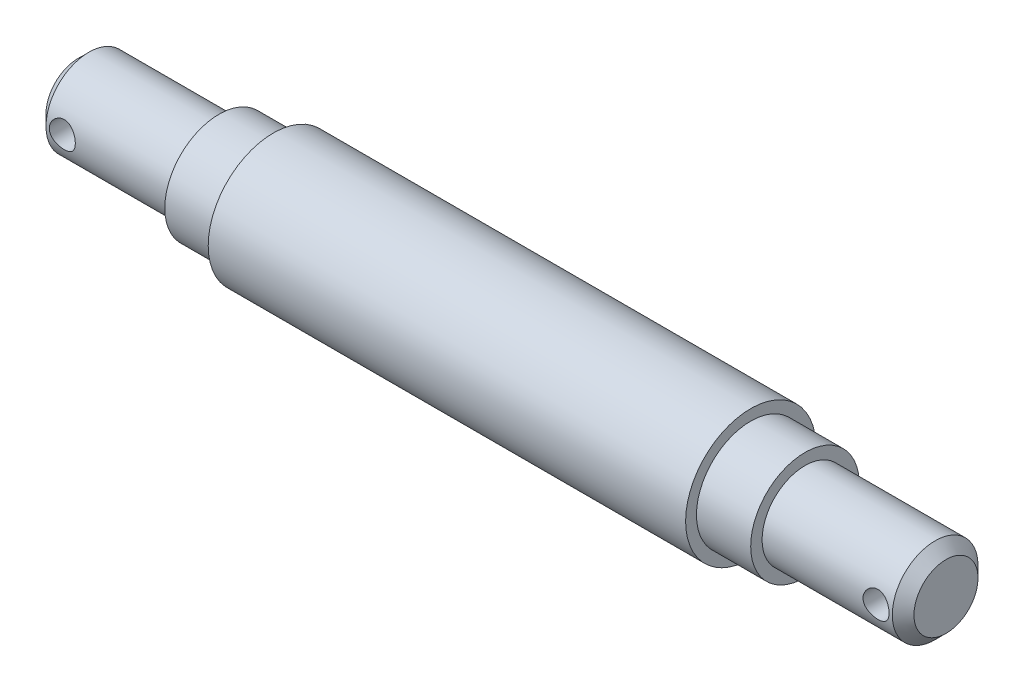
ISO-10303-21;
HEADER;
FILE_DESCRIPTION(('STEP AP214'),'2;1');
FILE_NAME('part.step','',(''),(''),'','','');
FILE_SCHEMA(('AUTOMOTIVE_DESIGN { 1 0 10303 214 1 1 1 1 }'));
ENDSEC;
DATA;
#1=APPLICATION_CONTEXT('core data for automotive mechanical design processes');
#2=APPLICATION_PROTOCOL_DEFINITION('international standard','automotive_design',2000,#1);
#3=PRODUCT_CONTEXT('',#1,'mechanical');
#4=PRODUCT('Part','Part','',(#3));
#5=PRODUCT_RELATED_PRODUCT_CATEGORY('part','',(#4));
#6=PRODUCT_DEFINITION_FORMATION('','',#4);
#7=PRODUCT_DEFINITION_CONTEXT('part definition',#1,'design');
#8=PRODUCT_DEFINITION('design','',#6,#7);
#9=PRODUCT_DEFINITION_SHAPE('','',#8);
#10=(LENGTH_UNIT() NAMED_UNIT(*) SI_UNIT(.MILLI.,.METRE.));
#11=(NAMED_UNIT(*) PLANE_ANGLE_UNIT() SI_UNIT($,.RADIAN.));
#12=(NAMED_UNIT(*) SI_UNIT($,.STERADIAN.) SOLID_ANGLE_UNIT());
#13=UNCERTAINTY_MEASURE_WITH_UNIT(LENGTH_MEASURE(1.E-05),#10,'distance_accuracy_value','');
#14=(GEOMETRIC_REPRESENTATION_CONTEXT(3) GLOBAL_UNCERTAINTY_ASSIGNED_CONTEXT((#13)) GLOBAL_UNIT_ASSIGNED_CONTEXT((#10,
#11,#12)) REPRESENTATION_CONTEXT('',''));
#15=CARTESIAN_POINT('',(0.,0.,0.));
#16=DIRECTION('',(0.,0.,1.));
#17=DIRECTION('',(1.,0.,0.));
#18=AXIS2_PLACEMENT_3D('',#15,#16,#17);
#19=CARTESIAN_POINT('',(-40.,0.,0.));
#20=DIRECTION('',(1.,0.,0.));
#21=DIRECTION('',(0.,0.,-1.));
#22=AXIS2_PLACEMENT_3D('',#19,#20,#21);
#23=PLANE('',#22);
#24=CARTESIAN_POINT('',(-40.,0.,0.));
#25=DIRECTION('',(-1.,0.,0.));
#26=DIRECTION('',(0.,0.,1.));
#27=AXIS2_PLACEMENT_3D('',#24,#25,#26);
#28=CIRCLE('',#27,2.94999999999999);
#29=CARTESIAN_POINT('',(-40.,0.,2.94999999999999));
#30=VERTEX_POINT('',#29);
#31=EDGE_CURVE('E51',#30,#30,#28,.T.);
#32=ORIENTED_EDGE('',*,*,#31,.T.);
#33=EDGE_LOOP('',(#32));
#34=FACE_BOUND('',#33,.T.);
#35=ADVANCED_FACE('F35',(#34),#23,.F.);
#36=CARTESIAN_POINT('',(-39.,0.,0.));
#37=DIRECTION('',(1.,0.,0.));
#38=DIRECTION('',(0.,0.,-1.));
#39=AXIS2_PLACEMENT_3D('',#36,#37,#38);
#40=CONICAL_SURFACE('',#39,3.95,0.785398163397455);
#41=ORIENTED_EDGE('',*,*,#31,.F.);
#42=EDGE_LOOP('',(#41));
#43=FACE_BOUND('',#42,.T.);
#44=CARTESIAN_POINT('',(-39.,0.,0.));
#45=DIRECTION('',(-1.,0.,0.));
#46=DIRECTION('',(0.,0.,1.));
#47=AXIS2_PLACEMENT_3D('',#44,#45,#46);
#48=CIRCLE('',#47,3.95);
#49=CARTESIAN_POINT('',(-39.,0.,3.95));
#50=VERTEX_POINT('',#49);
#51=EDGE_CURVE('E104',#50,#50,#48,.T.);
#52=ORIENTED_EDGE('',*,*,#51,.T.);
#53=EDGE_LOOP('',(#52));
#54=FACE_BOUND('',#53,.T.);
#55=ADVANCED_FACE('F89',(#43,#54),#40,.T.);
#56=CARTESIAN_POINT('',(-24.2500000000003,0.,0.));
#57=DIRECTION('',(-1.,0.,0.));
#58=DIRECTION('',(0.,0.,1.));
#59=AXIS2_PLACEMENT_3D('',#56,#57,#58);
#60=CYLINDRICAL_SURFACE('',#59,3.95);
#61=CARTESIAN_POINT('',(-36.3,0.,-3.95));
#62=CARTESIAN_POINT('',(-36.300000690933,0.0657921053393094,-3.94999950148961));
#63=CARTESIAN_POINT('',(-36.3054286576918,0.131591214838204,-3.94834057311497));
#64=CARTESIAN_POINT('',(-36.3269439672118,0.261270865350393,-3.94188498697175));
#65=CARTESIAN_POINT('',(-36.3430342580804,0.325150870627959,-3.93708746139313));
#66=CARTESIAN_POINT('',(-36.3852856297836,0.449103270402124,-3.92487988296748));
#67=CARTESIAN_POINT('',(-36.4114316323637,0.50918120966444,-3.91747374305666));
#68=CARTESIAN_POINT('',(-36.4729897091444,0.624100282433903,-3.90081718663398));
#69=CARTESIAN_POINT('',(-36.5084030854773,0.678940678549649,-3.89156651099519));
#70=CARTESIAN_POINT('',(-36.5885860705499,0.783438437222787,-3.87190239177238));
#71=CARTESIAN_POINT('',(-36.6335783919187,0.832920325244444,-3.86146466337096));
#72=CARTESIAN_POINT('',(-36.7311675694813,0.923765255505193,-3.84074643294284));
#73=CARTESIAN_POINT('',(-36.7837657424742,0.965126888957127,-3.83046595848297));
#74=CARTESIAN_POINT('',(-36.8965686001082,1.03948900030353,-3.81096820781043));
#75=CARTESIAN_POINT('',(-36.9569211668834,1.07227379069014,-3.80178104820255));
#76=CARTESIAN_POINT('',(-37.0826072076336,1.12715664878844,-3.78587377700204));
#77=CARTESIAN_POINT('',(-37.1479394463471,1.14925735687915,-3.77915305597243));
#78=CARTESIAN_POINT('',(-37.2797569157941,1.18150913793118,-3.76919296296908));
#79=CARTESIAN_POINT('',(-37.3461555367299,1.19198431895655,-3.76585939822971));
#80=CARTESIAN_POINT('',(-37.4798450148462,1.20169991107967,-3.76277100880303));
#81=CARTESIAN_POINT('',(-37.5471356454348,1.20094312272632,-3.76301529202458));
#82=CARTESIAN_POINT('',(-37.6780498429377,1.1884705081571,-3.76697161773738));
#83=CARTESIAN_POINT('',(-37.7417168139458,1.17716250700933,-3.7705546058486));
#84=CARTESIAN_POINT('',(-37.8662035288505,1.14456806673587,-3.78057558453502));
#85=CARTESIAN_POINT('',(-37.9270229846068,1.12328062017983,-3.7870138633498));
#86=CARTESIAN_POINT('',(-38.0450779447115,1.07103490290146,-3.80212175360936));
#87=CARTESIAN_POINT('',(-38.1022514804561,1.03994563160967,-3.81082129239325));
#88=CARTESIAN_POINT('',(-38.2107058624195,0.969069803090079,-3.82945730084039));
#89=CARTESIAN_POINT('',(-38.2619852446329,0.929281092164121,-3.8393940765405));
#90=CARTESIAN_POINT('',(-38.3595065546451,0.840117660833638,-3.85990662941459));
#91=CARTESIAN_POINT('',(-38.405438151735,0.790405027053217,-3.87049153542939));
#92=CARTESIAN_POINT('',(-38.4883858577331,0.683850928056173,-3.8907306221033));
#93=CARTESIAN_POINT('',(-38.525401376592,0.627008991414056,-3.90038474113935));
#94=CARTESIAN_POINT('',(-38.5896611261133,0.507235607809566,-3.91776652995739));
#95=CARTESIAN_POINT('',(-38.6168349617983,0.444264225815944,-3.92548020503653));
#96=CARTESIAN_POINT('',(-38.6601137212333,0.314356032727512,-3.93801108754001));
#97=CARTESIAN_POINT('',(-38.6762218141605,0.247420362956474,-3.94282912421219));
#98=CARTESIAN_POINT('',(-38.6963915971636,0.114120636053965,-3.94889402423303));
#99=CARTESIAN_POINT('',(-38.7008737318542,0.0478257706931107,-3.95026547137128));
#100=CARTESIAN_POINT('',(-38.6988449121654,-0.0845739664892664,-3.94964905795108));
#101=CARTESIAN_POINT('',(-38.6923354664712,-0.150678863138071,-3.94766165842204));
#102=CARTESIAN_POINT('',(-38.6688475153559,-0.279224843718514,-3.94063250926792));
#103=CARTESIAN_POINT('',(-38.6521160366409,-0.341715383064582,-3.93566287748284));
#104=CARTESIAN_POINT('',(-38.6089574364713,-0.462987512144226,-3.9232462867588));
#105=CARTESIAN_POINT('',(-38.5825291391859,-0.521768651064519,-3.91579902739437));
#106=CARTESIAN_POINT('',(-38.5200300694645,-0.635489778460969,-3.89897895098375));
#107=CARTESIAN_POINT('',(-38.4837471337022,-0.690306912058743,-3.88956496603778));
#108=CARTESIAN_POINT('',(-38.4028255485377,-0.793217107200202,-3.86989097410411));
#109=CARTESIAN_POINT('',(-38.3581847526315,-0.84130843583642,-3.85963075016098));
#110=CARTESIAN_POINT('',(-38.2598384942228,-0.931262194728943,-3.8389403158374));
#111=CARTESIAN_POINT('',(-38.2058569916246,-0.97282531590396,-3.82851804368209));
#112=CARTESIAN_POINT('',(-38.0914589910067,-1.04632580306949,-3.8090881755083));
#113=CARTESIAN_POINT('',(-38.0310426434882,-1.07826339411975,-3.80008054641565));
#114=CARTESIAN_POINT('',(-37.9056633501551,-1.13139313809661,-3.78460257028509));
#115=CARTESIAN_POINT('',(-37.8407221020247,-1.15263302867236,-3.77812098085675));
#116=CARTESIAN_POINT('',(-37.7079500152843,-1.18380847718295,-3.76847037643667));
#117=CARTESIAN_POINT('',(-37.6401202080419,-1.1937480353996,-3.76530018925136));
#118=CARTESIAN_POINT('',(-37.5066116331212,-1.20176405179564,-3.76274882724403));
#119=CARTESIAN_POINT('',(-37.440964821984,-1.20032934218194,-3.76321151382289));
#120=CARTESIAN_POINT('',(-37.3108949001397,-1.18680835860972,-3.76749719259433));
#121=CARTESIAN_POINT('',(-37.2464717381882,-1.17472253171075,-3.77132004375065));
#122=CARTESIAN_POINT('',(-37.1214994006159,-1.14056150948796,-3.78178924861813));
#123=CARTESIAN_POINT('',(-37.0609106104594,-1.11861887679372,-3.7883980639779));
#124=CARTESIAN_POINT('',(-36.9442260783663,-1.06547063438703,-3.80368682812306));
#125=CARTESIAN_POINT('',(-36.8881312157986,-1.03426321734227,-3.81236718094976));
#126=CARTESIAN_POINT('',(-36.7797664497775,-0.962110752635532,-3.83122441855044));
#127=CARTESIAN_POINT('',(-36.7277168082047,-0.920846329538669,-3.84144499898209));
#128=CARTESIAN_POINT('',(-36.6311223687421,-0.830322181374976,-3.86202232713825));
#129=CARTESIAN_POINT('',(-36.5865795418449,-0.781060363153478,-3.872379109857));
#130=CARTESIAN_POINT('',(-36.5049187361767,-0.674145848788934,-3.89243751616363));
#131=CARTESIAN_POINT('',(-36.4680660634471,-0.616284435684862,-3.90210985106116));
#132=CARTESIAN_POINT('',(-36.4046623886227,-0.494893212202999,-3.91935319911683));
#133=CARTESIAN_POINT('',(-36.3781067957638,-0.431365943417148,-3.92692514826385));
#134=CARTESIAN_POINT('',(-36.3382969627157,-0.307034616834357,-3.93849330935894));
#135=CARTESIAN_POINT('',(-36.3239752467099,-0.246597141950737,-3.94277212268364));
#136=CARTESIAN_POINT('',(-36.3048272807755,-0.124108329921254,-3.94852545465588));
#137=CARTESIAN_POINT('',(-36.2999993482893,-0.0620572807202983,-3.95000047021142));
#138=CARTESIAN_POINT('',(-36.3,0.,-3.95));
#139=B_SPLINE_CURVE_WITH_KNOTS('',3,(#61,#62,#63,#64,#65,#66,#67,#68,#69,#70,#71,#72,#73,#74,
#75,#76,#77,#78,#79,#80,#81,#82,#83,#84,#85,#86,#87,#88,#89,#90,#91,#92,#93,#94,#95,#96,#97,#98,
#99,#100,#101,#102,#103,#104,#105,#106,#107,#108,#109,#110,#111,#112,#113,#114,#115,#116,#117,
#118,#119,#120,#121,#122,#123,#124,#125,#126,#127,#128,#129,#130,#131,#132,#133,#134,#135,#136,
#137,#138),.UNSPECIFIED.,.T.,.F.,(4,2,2,2,2,2,2,2,2,2,2,2,2,2,2,2,2,2,2,2,2,2,2,2,2,2,2,2,2,2,2,
2,2,2,2,2,2,2,4),(0.,0.197148320035392,0.394351173873385,0.591259473294281,0.788195454606494,
0.990340802366874,1.19252118949645,1.39938126808359,1.60619019875128,1.80707614853398,
2.00791201079835,2.20129315930619,2.39469383394964,2.59079745889568,2.78694968780097,
2.99151370492323,3.19609125598955,3.40210447220443,3.6080586625695,3.80645362401528,
4.00482135632749,4.19857515486446,4.39235245564506,4.59068721838335,4.7890729884132,
4.9948598043899,5.2006418083801,5.40549720473314,5.61028006032374,5.80631124083041,
6.00233419370823,6.19579632450157,6.38929621983989,6.59000270555274,6.790761807026,
6.99759277849253,7.20433143185223,7.39032118612838,7.57627797496915),.UNSPECIFIED.);
#140=CARTESIAN_POINT('',(-36.3,0.,-3.95));
#141=VERTEX_POINT('',#140);
#142=EDGE_CURVE('E57',#141,#141,#139,.T.);
#143=ORIENTED_EDGE('',*,*,#142,.T.);
#144=EDGE_LOOP('',(#143));
#145=FACE_BOUND('',#144,.T.);
#146=CARTESIAN_POINT('',(-36.3,0.,3.95));
#147=CARTESIAN_POINT('',(-36.300000690933,-0.0657921053393094,3.94999950148961));
#148=CARTESIAN_POINT('',(-36.3054286576918,-0.131591214838204,3.94834057311497));
#149=CARTESIAN_POINT('',(-36.3269439672118,-0.261270865350393,3.94188498697175));
#150=CARTESIAN_POINT('',(-36.3430342580804,-0.325150870627959,3.93708746139313));
#151=CARTESIAN_POINT('',(-36.3852856297836,-0.449103270402124,3.92487988296748));
#152=CARTESIAN_POINT('',(-36.4114316323637,-0.50918120966444,3.91747374305666));
#153=CARTESIAN_POINT('',(-36.4729897091444,-0.624100282433903,3.90081718663398));
#154=CARTESIAN_POINT('',(-36.5084030854773,-0.678940678549649,3.89156651099519));
#155=CARTESIAN_POINT('',(-36.5885860705499,-0.783438437222787,3.87190239177238));
#156=CARTESIAN_POINT('',(-36.6335783919187,-0.832920325244444,3.86146466337096));
#157=CARTESIAN_POINT('',(-36.7311675694813,-0.923765255505193,3.84074643294284));
#158=CARTESIAN_POINT('',(-36.7837657424742,-0.965126888957127,3.83046595848297));
#159=CARTESIAN_POINT('',(-36.8965686001082,-1.03948900030353,3.81096820781043));
#160=CARTESIAN_POINT('',(-36.9569211668834,-1.07227379069014,3.80178104820255));
#161=CARTESIAN_POINT('',(-37.0826072076336,-1.12715664878844,3.78587377700204));
#162=CARTESIAN_POINT('',(-37.1479394463471,-1.14925735687915,3.77915305597243));
#163=CARTESIAN_POINT('',(-37.2797569157941,-1.18150913793118,3.76919296296908));
#164=CARTESIAN_POINT('',(-37.3461555367299,-1.19198431895655,3.76585939822971));
#165=CARTESIAN_POINT('',(-37.4798450148462,-1.20169991107967,3.76277100880303));
#166=CARTESIAN_POINT('',(-37.5471356454348,-1.20094312272632,3.76301529202458));
#167=CARTESIAN_POINT('',(-37.6780498429377,-1.1884705081571,3.76697161773738));
#168=CARTESIAN_POINT('',(-37.7417168139458,-1.17716250700933,3.7705546058486));
#169=CARTESIAN_POINT('',(-37.8662035288505,-1.14456806673587,3.78057558453502));
#170=CARTESIAN_POINT('',(-37.9270229846068,-1.12328062017983,3.7870138633498));
#171=CARTESIAN_POINT('',(-38.0450779447115,-1.07103490290146,3.80212175360936));
#172=CARTESIAN_POINT('',(-38.1022514804561,-1.03994563160967,3.81082129239325));
#173=CARTESIAN_POINT('',(-38.2107058624195,-0.969069803090079,3.82945730084039));
#174=CARTESIAN_POINT('',(-38.2619852446329,-0.929281092164121,3.8393940765405));
#175=CARTESIAN_POINT('',(-38.3595065546451,-0.840117660833638,3.85990662941459));
#176=CARTESIAN_POINT('',(-38.405438151735,-0.790405027053217,3.87049153542939));
#177=CARTESIAN_POINT('',(-38.4883858577331,-0.683850928056173,3.8907306221033));
#178=CARTESIAN_POINT('',(-38.525401376592,-0.627008991414056,3.90038474113935));
#179=CARTESIAN_POINT('',(-38.5896611261133,-0.507235607809566,3.91776652995739));
#180=CARTESIAN_POINT('',(-38.6168349617983,-0.444264225815944,3.92548020503653));
#181=CARTESIAN_POINT('',(-38.6601137212333,-0.314356032727512,3.93801108754001));
#182=CARTESIAN_POINT('',(-38.6762218141605,-0.247420362956474,3.94282912421219));
#183=CARTESIAN_POINT('',(-38.6963915971636,-0.114120636053965,3.94889402423303));
#184=CARTESIAN_POINT('',(-38.7008737318542,-0.0478257706931107,3.95026547137128));
#185=CARTESIAN_POINT('',(-38.6988449121654,0.0845739664892664,3.94964905795108));
#186=CARTESIAN_POINT('',(-38.6923354664712,0.150678863138071,3.94766165842204));
#187=CARTESIAN_POINT('',(-38.6688475153559,0.279224843718514,3.94063250926792));
#188=CARTESIAN_POINT('',(-38.6521160366409,0.341715383064582,3.93566287748284));
#189=CARTESIAN_POINT('',(-38.6089574364713,0.462987512144226,3.9232462867588));
#190=CARTESIAN_POINT('',(-38.5825291391859,0.521768651064519,3.91579902739437));
#191=CARTESIAN_POINT('',(-38.5200300694645,0.635489778460969,3.89897895098375));
#192=CARTESIAN_POINT('',(-38.4837471337022,0.690306912058743,3.88956496603778));
#193=CARTESIAN_POINT('',(-38.4028255485377,0.793217107200202,3.86989097410411));
#194=CARTESIAN_POINT('',(-38.3581847526315,0.84130843583642,3.85963075016098));
#195=CARTESIAN_POINT('',(-38.2598384942228,0.931262194728943,3.8389403158374));
#196=CARTESIAN_POINT('',(-38.2058569916246,0.97282531590396,3.82851804368209));
#197=CARTESIAN_POINT('',(-38.0914589910067,1.04632580306949,3.8090881755083));
#198=CARTESIAN_POINT('',(-38.0310426434882,1.07826339411975,3.80008054641565));
#199=CARTESIAN_POINT('',(-37.9056633501551,1.13139313809661,3.78460257028509));
#200=CARTESIAN_POINT('',(-37.8407221020247,1.15263302867236,3.77812098085675));
#201=CARTESIAN_POINT('',(-37.7079500152843,1.18380847718295,3.76847037643667));
#202=CARTESIAN_POINT('',(-37.6401202080419,1.1937480353996,3.76530018925136));
#203=CARTESIAN_POINT('',(-37.5066116331212,1.20176405179564,3.76274882724403));
#204=CARTESIAN_POINT('',(-37.440964821984,1.20032934218194,3.76321151382289));
#205=CARTESIAN_POINT('',(-37.3108949001397,1.18680835860972,3.76749719259433));
#206=CARTESIAN_POINT('',(-37.2464717381882,1.17472253171075,3.77132004375065));
#207=CARTESIAN_POINT('',(-37.1214994006159,1.14056150948796,3.78178924861813));
#208=CARTESIAN_POINT('',(-37.0609106104594,1.11861887679372,3.7883980639779));
#209=CARTESIAN_POINT('',(-36.9442260783663,1.06547063438703,3.80368682812306));
#210=CARTESIAN_POINT('',(-36.8881312157986,1.03426321734227,3.81236718094976));
#211=CARTESIAN_POINT('',(-36.7797664497775,0.962110752635532,3.83122441855044));
#212=CARTESIAN_POINT('',(-36.7277168082047,0.920846329538669,3.84144499898209));
#213=CARTESIAN_POINT('',(-36.6311223687421,0.830322181374976,3.86202232713825));
#214=CARTESIAN_POINT('',(-36.5865795418449,0.781060363153478,3.872379109857));
#215=CARTESIAN_POINT('',(-36.5049187361767,0.674145848788934,3.89243751616363));
#216=CARTESIAN_POINT('',(-36.4680660634471,0.616284435684862,3.90210985106116));
#217=CARTESIAN_POINT('',(-36.4046623886227,0.494893212202999,3.91935319911683));
#218=CARTESIAN_POINT('',(-36.3781067957638,0.431365943417148,3.92692514826385));
#219=CARTESIAN_POINT('',(-36.3382969627157,0.307034616834357,3.93849330935894));
#220=CARTESIAN_POINT('',(-36.3239752467099,0.246597141950737,3.94277212268364));
#221=CARTESIAN_POINT('',(-36.3048272807755,0.124108329921254,3.94852545465588));
#222=CARTESIAN_POINT('',(-36.2999993482893,0.0620572807202983,3.95000047021142));
#223=CARTESIAN_POINT('',(-36.3,0.,3.95));
#224=B_SPLINE_CURVE_WITH_KNOTS('',3,(#146,#147,#148,#149,#150,#151,#152,#153,#154,#155,#156,
#157,#158,#159,#160,#161,#162,#163,#164,#165,#166,#167,#168,#169,#170,#171,#172,#173,#174,#175,
#176,#177,#178,#179,#180,#181,#182,#183,#184,#185,#186,#187,#188,#189,#190,#191,#192,#193,#194,
#195,#196,#197,#198,#199,#200,#201,#202,#203,#204,#205,#206,#207,#208,#209,#210,#211,#212,#213,
#214,#215,#216,#217,#218,#219,#220,#221,#222,#223),.UNSPECIFIED.,.T.,.F.,(4,2,2,2,2,2,2,2,2,2,2,
2,2,2,2,2,2,2,2,2,2,2,2,2,2,2,2,2,2,2,2,2,2,2,2,2,2,2,4),(0.,0.197148320035392,
0.394351173873385,0.591259473294281,0.788195454606494,0.990340802366874,1.19252118949645,
1.39938126808359,1.60619019875128,1.80707614853398,2.00791201079835,2.20129315930619,
2.39469383394964,2.59079745889568,2.78694968780097,2.99151370492323,3.19609125598955,
3.40210447220443,3.6080586625695,3.80645362401528,4.00482135632749,4.19857515486446,
4.39235245564506,4.59068721838335,4.7890729884132,4.9948598043899,5.2006418083801,
5.40549720473314,5.61028006032374,5.80631124083041,6.00233419370823,6.19579632450157,
6.38929621983989,6.59000270555274,6.790761807026,6.99759277849253,7.20433143185223,
7.39032118612838,7.57627797496915),.UNSPECIFIED.);
#225=CARTESIAN_POINT('',(-36.3,0.,3.95));
#226=VERTEX_POINT('',#225);
#227=EDGE_CURVE('E47',#226,#226,#224,.T.);
#228=ORIENTED_EDGE('',*,*,#227,.T.);
#229=EDGE_LOOP('',(#228));
#230=FACE_BOUND('',#229,.T.);
#231=ORIENTED_EDGE('',*,*,#51,.F.);
#232=EDGE_LOOP('',(#231));
#233=FACE_BOUND('',#232,.T.);
#234=CARTESIAN_POINT('',(-27.,0.,0.));
#235=DIRECTION('',(-1.,0.,0.));
#236=DIRECTION('',(0.,0.,1.));
#237=AXIS2_PLACEMENT_3D('',#234,#235,#236);
#238=CIRCLE('',#237,3.95);
#239=CARTESIAN_POINT('',(-27.,0.,3.95));
#240=VERTEX_POINT('',#239);
#241=EDGE_CURVE('E106',#240,#240,#238,.T.);
#242=ORIENTED_EDGE('',*,*,#241,.T.);
#243=EDGE_LOOP('',(#242));
#244=FACE_BOUND('',#243,.T.);
#245=ADVANCED_FACE('F84',(#145,#230,#233,#244),#60,.T.);
#246=CARTESIAN_POINT('',(-27.,3.95,0.));
#247=DIRECTION('',(1.,0.,0.));
#248=DIRECTION('',(0.,0.,-1.));
#249=AXIS2_PLACEMENT_3D('',#246,#247,#248);
#250=PLANE('',#249);
#251=ORIENTED_EDGE('',*,*,#241,.F.);
#252=EDGE_LOOP('',(#251));
#253=FACE_BOUND('',#252,.T.);
#254=CARTESIAN_POINT('',(-27.,0.,0.));
#255=DIRECTION('',(-1.,0.,0.));
#256=DIRECTION('',(0.,0.,1.));
#257=AXIS2_PLACEMENT_3D('',#254,#255,#256);
#258=CIRCLE('',#257,5.);
#259=CARTESIAN_POINT('',(-27.,0.,5.));
#260=VERTEX_POINT('',#259);
#261=EDGE_CURVE('E108',#260,#260,#258,.T.);
#262=ORIENTED_EDGE('',*,*,#261,.T.);
#263=EDGE_LOOP('',(#262));
#264=FACE_BOUND('',#263,.T.);
#265=ADVANCED_FACE('F88',(#253,#264),#250,.F.);
#266=CARTESIAN_POINT('',(-24.2500000000003,0.,0.));
#267=DIRECTION('',(-1.,0.,0.));
#268=DIRECTION('',(0.,0.,1.));
#269=AXIS2_PLACEMENT_3D('',#266,#267,#268);
#270=CYLINDRICAL_SURFACE('',#269,5.);
#271=ORIENTED_EDGE('',*,*,#261,.F.);
#272=EDGE_LOOP('',(#271));
#273=FACE_BOUND('',#272,.T.);
#274=CARTESIAN_POINT('',(-22.,0.,0.));
#275=DIRECTION('',(-1.,0.,0.));
#276=DIRECTION('',(0.,0.,1.));
#277=AXIS2_PLACEMENT_3D('',#274,#275,#276);
#278=CIRCLE('',#277,5.);
#279=CARTESIAN_POINT('',(-22.,0.,5.));
#280=VERTEX_POINT('',#279);
#281=EDGE_CURVE('E113',#280,#280,#278,.T.);
#282=ORIENTED_EDGE('',*,*,#281,.T.);
#283=EDGE_LOOP('',(#282));
#284=FACE_BOUND('',#283,.T.);
#285=ADVANCED_FACE('F216',(#273,#284),#270,.T.);
#286=CARTESIAN_POINT('',(-22.,5.,0.));
#287=DIRECTION('',(1.,0.,0.));
#288=DIRECTION('',(0.,0.,-1.));
#289=AXIS2_PLACEMENT_3D('',#286,#287,#288);
#290=PLANE('',#289);
#291=ORIENTED_EDGE('',*,*,#281,.F.);
#292=EDGE_LOOP('',(#291));
#293=FACE_BOUND('',#292,.T.);
#294=CARTESIAN_POINT('',(-22.,0.,0.));
#295=DIRECTION('',(-1.,0.,0.));
#296=DIRECTION('',(0.,0.,1.));
#297=AXIS2_PLACEMENT_3D('',#294,#295,#296);
#298=CIRCLE('',#297,6.00000000000001);
#299=CARTESIAN_POINT('',(-22.,0.,6.00000000000001));
#300=VERTEX_POINT('',#299);
#301=EDGE_CURVE('E116',#300,#300,#298,.T.);
#302=ORIENTED_EDGE('',*,*,#301,.T.);
#303=EDGE_LOOP('',(#302));
#304=FACE_BOUND('',#303,.T.);
#305=ADVANCED_FACE('F208',(#293,#304),#290,.F.);
#306=CARTESIAN_POINT('',(-24.2500000000003,0.,0.));
#307=DIRECTION('',(-1.,0.,0.));
#308=DIRECTION('',(0.,0.,1.));
#309=AXIS2_PLACEMENT_3D('',#306,#307,#308);
#310=CYLINDRICAL_SURFACE('',#309,6.00000000000001);
#311=ORIENTED_EDGE('',*,*,#301,.F.);
#312=EDGE_LOOP('',(#311));
#313=FACE_BOUND('',#312,.T.);
#314=CARTESIAN_POINT('',(22.,0.,0.));
#315=DIRECTION('',(-1.,0.,0.));
#316=DIRECTION('',(0.,0.,1.));
#317=AXIS2_PLACEMENT_3D('',#314,#315,#316);
#318=CIRCLE('',#317,6.00000000000001);
#319=CARTESIAN_POINT('',(22.,0.,6.00000000000001));
#320=VERTEX_POINT('',#319);
#321=EDGE_CURVE('E119',#320,#320,#318,.T.);
#322=ORIENTED_EDGE('',*,*,#321,.T.);
#323=EDGE_LOOP('',(#322));
#324=FACE_BOUND('',#323,.T.);
#325=ADVANCED_FACE('F200',(#313,#324),#310,.T.);
#326=CARTESIAN_POINT('',(22.,6.00000000000001,0.));
#327=DIRECTION('',(-1.,0.,0.));
#328=DIRECTION('',(0.,0.,1.));
#329=AXIS2_PLACEMENT_3D('',#326,#327,#328);
#330=PLANE('',#329);
#331=ORIENTED_EDGE('',*,*,#321,.F.);
#332=EDGE_LOOP('',(#331));
#333=FACE_BOUND('',#332,.T.);
#334=CARTESIAN_POINT('',(22.,0.,0.));
#335=DIRECTION('',(-1.,0.,0.));
#336=DIRECTION('',(0.,0.,1.));
#337=AXIS2_PLACEMENT_3D('',#334,#335,#336);
#338=CIRCLE('',#337,5.);
#339=CARTESIAN_POINT('',(22.,0.,5.));
#340=VERTEX_POINT('',#339);
#341=EDGE_CURVE('E122',#340,#340,#338,.T.);
#342=ORIENTED_EDGE('',*,*,#341,.T.);
#343=EDGE_LOOP('',(#342));
#344=FACE_BOUND('',#343,.T.);
#345=ADVANCED_FACE('F192',(#333,#344),#330,.F.);
#346=CARTESIAN_POINT('',(-24.2500000000003,0.,0.));
#347=DIRECTION('',(-1.,0.,0.));
#348=DIRECTION('',(0.,0.,1.));
#349=AXIS2_PLACEMENT_3D('',#346,#347,#348);
#350=CYLINDRICAL_SURFACE('',#349,5.);
#351=ORIENTED_EDGE('',*,*,#341,.F.);
#352=EDGE_LOOP('',(#351));
#353=FACE_BOUND('',#352,.T.);
#354=CARTESIAN_POINT('',(27.,0.,0.));
#355=DIRECTION('',(-1.,0.,0.));
#356=DIRECTION('',(0.,0.,1.));
#357=AXIS2_PLACEMENT_3D('',#354,#355,#356);
#358=CIRCLE('',#357,5.);
#359=CARTESIAN_POINT('',(27.,0.,5.));
#360=VERTEX_POINT('',#359);
#361=EDGE_CURVE('E125',#360,#360,#358,.T.);
#362=ORIENTED_EDGE('',*,*,#361,.T.);
#363=EDGE_LOOP('',(#362));
#364=FACE_BOUND('',#363,.T.);
#365=ADVANCED_FACE('F186',(#353,#364),#350,.T.);
#366=CARTESIAN_POINT('',(27.,5.,0.));
#367=DIRECTION('',(-1.,0.,0.));
#368=DIRECTION('',(0.,0.,1.));
#369=AXIS2_PLACEMENT_3D('',#366,#367,#368);
#370=PLANE('',#369);
#371=ORIENTED_EDGE('',*,*,#361,.F.);
#372=EDGE_LOOP('',(#371));
#373=FACE_BOUND('',#372,.T.);
#374=CARTESIAN_POINT('',(27.,0.,0.));
#375=DIRECTION('',(-1.,0.,0.));
#376=DIRECTION('',(0.,0.,1.));
#377=AXIS2_PLACEMENT_3D('',#374,#375,#376);
#378=CIRCLE('',#377,3.95);
#379=CARTESIAN_POINT('',(27.,0.,3.95));
#380=VERTEX_POINT('',#379);
#381=EDGE_CURVE('E128',#380,#380,#378,.T.);
#382=ORIENTED_EDGE('',*,*,#381,.T.);
#383=EDGE_LOOP('',(#382));
#384=FACE_BOUND('',#383,.T.);
#385=ADVANCED_FACE('F146',(#373,#384),#370,.F.);
#386=CARTESIAN_POINT('',(-24.2500000000003,0.,0.));
#387=DIRECTION('',(-1.,0.,0.));
#388=DIRECTION('',(0.,0.,1.));
#389=AXIS2_PLACEMENT_3D('',#386,#387,#388);
#390=CYLINDRICAL_SURFACE('',#389,3.95);
#391=CARTESIAN_POINT('',(38.7,0.,-3.95));
#392=CARTESIAN_POINT('',(38.699999309067,0.0657921053393098,-3.94999950148961));
#393=CARTESIAN_POINT('',(38.6945713423082,0.131591214838204,-3.94834057311497));
#394=CARTESIAN_POINT('',(38.6730560327882,0.261270865350394,-3.94188498697175));
#395=CARTESIAN_POINT('',(38.6569657419196,0.32515087062796,-3.93708746139313));
#396=CARTESIAN_POINT('',(38.6147143702164,0.449103270402124,-3.92487988296748));
#397=CARTESIAN_POINT('',(38.5885683676363,0.50918120966444,-3.91747374305666));
#398=CARTESIAN_POINT('',(38.5270102908556,0.624100282433903,-3.90081718663398));
#399=CARTESIAN_POINT('',(38.4915969145227,0.678940678549649,-3.89156651099519));
#400=CARTESIAN_POINT('',(38.4114139294501,0.783438437222787,-3.87190239177238));
#401=CARTESIAN_POINT('',(38.3664216080813,0.832920325244444,-3.86146466337096));
#402=CARTESIAN_POINT('',(38.2688324305187,0.923765255505193,-3.84074643294284));
#403=CARTESIAN_POINT('',(38.2162342575258,0.965126888957127,-3.83046595848297));
#404=CARTESIAN_POINT('',(38.1034313998918,1.03948900030353,-3.81096820781043));
#405=CARTESIAN_POINT('',(38.0430788331166,1.07227379069014,-3.80178104820255));
#406=CARTESIAN_POINT('',(37.9173927923664,1.12715664878844,-3.78587377700204));
#407=CARTESIAN_POINT('',(37.8520605536529,1.14925735687915,-3.77915305597243));
#408=CARTESIAN_POINT('',(37.7202430842059,1.18150913793118,-3.76919296296908));
#409=CARTESIAN_POINT('',(37.6538444632701,1.19198431895655,-3.76585939822971));
#410=CARTESIAN_POINT('',(37.5201549851538,1.20169991107967,-3.76277100880303));
#411=CARTESIAN_POINT('',(37.4528643545652,1.20094312272632,-3.76301529202458));
#412=CARTESIAN_POINT('',(37.3219501570623,1.1884705081571,-3.76697161773738));
#413=CARTESIAN_POINT('',(37.2582831860542,1.17716250700933,-3.7705546058486));
#414=CARTESIAN_POINT('',(37.1337964711495,1.14456806673587,-3.78057558453502));
#415=CARTESIAN_POINT('',(37.0729770153932,1.12328062017983,-3.7870138633498));
#416=CARTESIAN_POINT('',(36.9549220552886,1.07103490290146,-3.80212175360936));
#417=CARTESIAN_POINT('',(36.897748519544,1.03994563160967,-3.81082129239325));
#418=CARTESIAN_POINT('',(36.7892941375805,0.969069803090079,-3.82945730084039));
#419=CARTESIAN_POINT('',(36.7380147553672,0.929281092164121,-3.8393940765405));
#420=CARTESIAN_POINT('',(36.6404934453549,0.840117660833638,-3.85990662941459));
#421=CARTESIAN_POINT('',(36.594561848265,0.790405027053217,-3.87049153542939));
#422=CARTESIAN_POINT('',(36.5116141422669,0.683850928056173,-3.8907306221033));
#423=CARTESIAN_POINT('',(36.474598623408,0.627008991414056,-3.90038474113935));
#424=CARTESIAN_POINT('',(36.4103388738867,0.507235607809566,-3.91776652995739));
#425=CARTESIAN_POINT('',(36.3831650382018,0.444264225815944,-3.92548020503653));
#426=CARTESIAN_POINT('',(36.3398862787667,0.314356032727512,-3.93801108754001));
#427=CARTESIAN_POINT('',(36.3237781858395,0.247420362956474,-3.94282912421219));
#428=CARTESIAN_POINT('',(36.3036084028364,0.114120636053965,-3.94889402423303));
#429=CARTESIAN_POINT('',(36.2991262681458,0.0478257706931107,-3.95026547137128));
#430=CARTESIAN_POINT('',(36.3011550878346,-0.0845739664892664,-3.94964905795108));
#431=CARTESIAN_POINT('',(36.3076645335288,-0.150678863138071,-3.94766165842204));
#432=CARTESIAN_POINT('',(36.3311524846441,-0.279224843718514,-3.94063250926792));
#433=CARTESIAN_POINT('',(36.3478839633591,-0.341715383064582,-3.93566287748284));
#434=CARTESIAN_POINT('',(36.3910425635287,-0.462987512144226,-3.9232462867588));
#435=CARTESIAN_POINT('',(36.4174708608141,-0.521768651064519,-3.91579902739437));
#436=CARTESIAN_POINT('',(36.4799699305355,-0.635489778460969,-3.89897895098375));
#437=CARTESIAN_POINT('',(36.5162528662978,-0.690306912058743,-3.88956496603778));
#438=CARTESIAN_POINT('',(36.5971744514623,-0.793217107200202,-3.86989097410411));
#439=CARTESIAN_POINT('',(36.6418152473686,-0.84130843583642,-3.85963075016098));
#440=CARTESIAN_POINT('',(36.7401615057772,-0.931262194728943,-3.8389403158374));
#441=CARTESIAN_POINT('',(36.7941430083754,-0.97282531590396,-3.82851804368209));
#442=CARTESIAN_POINT('',(36.9085410089933,-1.04632580306949,-3.8090881755083));
#443=CARTESIAN_POINT('',(36.9689573565118,-1.07826339411975,-3.80008054641565));
#444=CARTESIAN_POINT('',(37.0943366498449,-1.13139313809661,-3.78460257028509));
#445=CARTESIAN_POINT('',(37.1592778979753,-1.15263302867236,-3.77812098085675));
#446=CARTESIAN_POINT('',(37.2920499847157,-1.18380847718295,-3.76847037643667));
#447=CARTESIAN_POINT('',(37.3598797919581,-1.1937480353996,-3.76530018925136));
#448=CARTESIAN_POINT('',(37.4933883668788,-1.20176405179564,-3.76274882724403));
#449=CARTESIAN_POINT('',(37.559035178016,-1.20032934218194,-3.76321151382289));
#450=CARTESIAN_POINT('',(37.6891050998603,-1.18680835860972,-3.76749719259433));
#451=CARTESIAN_POINT('',(37.7535282618118,-1.17472253171075,-3.77132004375065));
#452=CARTESIAN_POINT('',(37.8785005993841,-1.14056150948796,-3.78178924861813));
#453=CARTESIAN_POINT('',(37.9390893895407,-1.11861887679372,-3.7883980639779));
#454=CARTESIAN_POINT('',(38.0557739216337,-1.06547063438703,-3.80368682812306));
#455=CARTESIAN_POINT('',(38.1118687842014,-1.03426321734227,-3.81236718094976));
#456=CARTESIAN_POINT('',(38.2202335502225,-0.962110752635533,-3.83122441855044));
#457=CARTESIAN_POINT('',(38.2722831917953,-0.920846329538672,-3.84144499898209));
#458=CARTESIAN_POINT('',(38.368877631258,-0.830322181374979,-3.86202232713825));
#459=CARTESIAN_POINT('',(38.4134204581552,-0.781060363153479,-3.872379109857));
#460=CARTESIAN_POINT('',(38.4950812638234,-0.674145848788932,-3.89243751616363));
#461=CARTESIAN_POINT('',(38.5319339365529,-0.616284435684859,-3.90210985106116));
#462=CARTESIAN_POINT('',(38.5953376113773,-0.494893212202995,-3.91935319911683));
#463=CARTESIAN_POINT('',(38.6218932042363,-0.431365943417146,-3.92692514826385));
#464=CARTESIAN_POINT('',(38.6617030372843,-0.307034616834357,-3.93849330935894));
#465=CARTESIAN_POINT('',(38.6760247532901,-0.246597141950738,-3.94277212268364));
#466=CARTESIAN_POINT('',(38.6951727192245,-0.124108329921256,-3.94852545465588));
#467=CARTESIAN_POINT('',(38.7000006517107,-0.062057280720299,-3.95000047021142));
#468=CARTESIAN_POINT('',(38.7,0.,-3.95));
#469=B_SPLINE_CURVE_WITH_KNOTS('',3,(#391,#392,#393,#394,#395,#396,#397,#398,#399,#400,#401,
#402,#403,#404,#405,#406,#407,#408,#409,#410,#411,#412,#413,#414,#415,#416,#417,#418,#419,#420,
#421,#422,#423,#424,#425,#426,#427,#428,#429,#430,#431,#432,#433,#434,#435,#436,#437,#438,#439,
#440,#441,#442,#443,#444,#445,#446,#447,#448,#449,#450,#451,#452,#453,#454,#455,#456,#457,#458,
#459,#460,#461,#462,#463,#464,#465,#466,#467,#468),.UNSPECIFIED.,.T.,.F.,(4,2,2,2,2,2,2,2,2,2,2,
2,2,2,2,2,2,2,2,2,2,2,2,2,2,2,2,2,2,2,2,2,2,2,2,2,2,2,4),(0.,0.197148320035393,
0.394351173873385,0.591259473294281,0.788195454606494,0.990340802366874,1.19252118949645,
1.39938126808359,1.60619019875128,1.80707614853398,2.00791201079835,2.20129315930619,
2.39469383394964,2.59079745889568,2.78694968780097,2.99151370492323,3.19609125598955,
3.40210447220443,3.6080586625695,3.80645362401528,4.00482135632749,4.19857515486446,
4.39235245564506,4.59068721838335,4.7890729884132,4.9948598043899,5.2006418083801,
5.40549720473314,5.61028006032374,5.80631124083041,6.00233419370823,6.19579632450157,
6.38929621983989,6.59000270555274,6.790761807026,6.99759277849254,7.20433143185223,
7.39032118612838,7.57627797496915),.UNSPECIFIED.);
#470=CARTESIAN_POINT('',(38.7,0.,-3.95));
#471=VERTEX_POINT('',#470);
#472=EDGE_CURVE('E38',#471,#471,#469,.T.);
#473=ORIENTED_EDGE('',*,*,#472,.T.);
#474=EDGE_LOOP('',(#473));
#475=FACE_BOUND('',#474,.T.);
#476=CARTESIAN_POINT('',(38.7,0.,3.95));
#477=CARTESIAN_POINT('',(38.699999309067,-0.0657921053393098,3.94999950148961));
#478=CARTESIAN_POINT('',(38.6945713423082,-0.131591214838204,3.94834057311497));
#479=CARTESIAN_POINT('',(38.6730560327882,-0.261270865350394,3.94188498697175));
#480=CARTESIAN_POINT('',(38.6569657419196,-0.32515087062796,3.93708746139313));
#481=CARTESIAN_POINT('',(38.6147143702164,-0.449103270402124,3.92487988296748));
#482=CARTESIAN_POINT('',(38.5885683676363,-0.50918120966444,3.91747374305666));
#483=CARTESIAN_POINT('',(38.5270102908556,-0.624100282433903,3.90081718663398));
#484=CARTESIAN_POINT('',(38.4915969145227,-0.678940678549649,3.89156651099519));
#485=CARTESIAN_POINT('',(38.4114139294501,-0.783438437222787,3.87190239177238));
#486=CARTESIAN_POINT('',(38.3664216080813,-0.832920325244444,3.86146466337096));
#487=CARTESIAN_POINT('',(38.2688324305187,-0.923765255505193,3.84074643294284));
#488=CARTESIAN_POINT('',(38.2162342575258,-0.965126888957127,3.83046595848297));
#489=CARTESIAN_POINT('',(38.1034313998918,-1.03948900030353,3.81096820781043));
#490=CARTESIAN_POINT('',(38.0430788331166,-1.07227379069014,3.80178104820255));
#491=CARTESIAN_POINT('',(37.9173927923664,-1.12715664878844,3.78587377700204));
#492=CARTESIAN_POINT('',(37.8520605536529,-1.14925735687915,3.77915305597243));
#493=CARTESIAN_POINT('',(37.7202430842059,-1.18150913793118,3.76919296296908));
#494=CARTESIAN_POINT('',(37.6538444632701,-1.19198431895655,3.76585939822971));
#495=CARTESIAN_POINT('',(37.5201549851538,-1.20169991107967,3.76277100880303));
#496=CARTESIAN_POINT('',(37.4528643545652,-1.20094312272632,3.76301529202458));
#497=CARTESIAN_POINT('',(37.3219501570623,-1.1884705081571,3.76697161773738));
#498=CARTESIAN_POINT('',(37.2582831860542,-1.17716250700933,3.7705546058486));
#499=CARTESIAN_POINT('',(37.1337964711495,-1.14456806673587,3.78057558453502));
#500=CARTESIAN_POINT('',(37.0729770153932,-1.12328062017983,3.7870138633498));
#501=CARTESIAN_POINT('',(36.9549220552886,-1.07103490290146,3.80212175360936));
#502=CARTESIAN_POINT('',(36.897748519544,-1.03994563160967,3.81082129239325));
#503=CARTESIAN_POINT('',(36.7892941375805,-0.969069803090079,3.82945730084039));
#504=CARTESIAN_POINT('',(36.7380147553672,-0.929281092164121,3.8393940765405));
#505=CARTESIAN_POINT('',(36.6404934453549,-0.840117660833638,3.85990662941459));
#506=CARTESIAN_POINT('',(36.594561848265,-0.790405027053217,3.87049153542939));
#507=CARTESIAN_POINT('',(36.5116141422669,-0.683850928056173,3.8907306221033));
#508=CARTESIAN_POINT('',(36.474598623408,-0.627008991414056,3.90038474113935));
#509=CARTESIAN_POINT('',(36.4103388738867,-0.507235607809566,3.91776652995739));
#510=CARTESIAN_POINT('',(36.3831650382018,-0.444264225815944,3.92548020503653));
#511=CARTESIAN_POINT('',(36.3398862787667,-0.314356032727512,3.93801108754001));
#512=CARTESIAN_POINT('',(36.3237781858395,-0.247420362956474,3.94282912421219));
#513=CARTESIAN_POINT('',(36.3036084028364,-0.114120636053965,3.94889402423303));
#514=CARTESIAN_POINT('',(36.2991262681458,-0.0478257706931107,3.95026547137128));
#515=CARTESIAN_POINT('',(36.3011550878346,0.0845739664892664,3.94964905795108));
#516=CARTESIAN_POINT('',(36.3076645335288,0.150678863138071,3.94766165842204));
#517=CARTESIAN_POINT('',(36.3311524846441,0.279224843718514,3.94063250926792));
#518=CARTESIAN_POINT('',(36.3478839633591,0.341715383064582,3.93566287748284));
#519=CARTESIAN_POINT('',(36.3910425635287,0.462987512144226,3.9232462867588));
#520=CARTESIAN_POINT('',(36.4174708608141,0.521768651064519,3.91579902739437));
#521=CARTESIAN_POINT('',(36.4799699305355,0.635489778460969,3.89897895098375));
#522=CARTESIAN_POINT('',(36.5162528662978,0.690306912058743,3.88956496603778));
#523=CARTESIAN_POINT('',(36.5971744514623,0.793217107200202,3.86989097410411));
#524=CARTESIAN_POINT('',(36.6418152473686,0.84130843583642,3.85963075016098));
#525=CARTESIAN_POINT('',(36.7401615057772,0.931262194728943,3.8389403158374));
#526=CARTESIAN_POINT('',(36.7941430083754,0.97282531590396,3.82851804368209));
#527=CARTESIAN_POINT('',(36.9085410089933,1.04632580306949,3.8090881755083));
#528=CARTESIAN_POINT('',(36.9689573565118,1.07826339411975,3.80008054641565));
#529=CARTESIAN_POINT('',(37.0943366498449,1.13139313809661,3.78460257028509));
#530=CARTESIAN_POINT('',(37.1592778979753,1.15263302867236,3.77812098085675));
#531=CARTESIAN_POINT('',(37.2920499847157,1.18380847718295,3.76847037643667));
#532=CARTESIAN_POINT('',(37.3598797919581,1.1937480353996,3.76530018925136));
#533=CARTESIAN_POINT('',(37.4933883668788,1.20176405179564,3.76274882724403));
#534=CARTESIAN_POINT('',(37.559035178016,1.20032934218194,3.76321151382289));
#535=CARTESIAN_POINT('',(37.6891050998603,1.18680835860972,3.76749719259433));
#536=CARTESIAN_POINT('',(37.7535282618118,1.17472253171075,3.77132004375065));
#537=CARTESIAN_POINT('',(37.8785005993841,1.14056150948796,3.78178924861813));
#538=CARTESIAN_POINT('',(37.9390893895407,1.11861887679372,3.7883980639779));
#539=CARTESIAN_POINT('',(38.0557739216337,1.06547063438703,3.80368682812306));
#540=CARTESIAN_POINT('',(38.1118687842014,1.03426321734227,3.81236718094976));
#541=CARTESIAN_POINT('',(38.2202335502225,0.962110752635533,3.83122441855044));
#542=CARTESIAN_POINT('',(38.2722831917953,0.920846329538672,3.84144499898209));
#543=CARTESIAN_POINT('',(38.368877631258,0.830322181374979,3.86202232713825));
#544=CARTESIAN_POINT('',(38.4134204581552,0.781060363153479,3.872379109857));
#545=CARTESIAN_POINT('',(38.4950812638234,0.674145848788932,3.89243751616363));
#546=CARTESIAN_POINT('',(38.5319339365529,0.616284435684859,3.90210985106116));
#547=CARTESIAN_POINT('',(38.5953376113773,0.494893212202995,3.91935319911683));
#548=CARTESIAN_POINT('',(38.6218932042363,0.431365943417146,3.92692514826385));
#549=CARTESIAN_POINT('',(38.6617030372843,0.307034616834357,3.93849330935894));
#550=CARTESIAN_POINT('',(38.6760247532901,0.246597141950738,3.94277212268364));
#551=CARTESIAN_POINT('',(38.6951727192245,0.124108329921256,3.94852545465588));
#552=CARTESIAN_POINT('',(38.7000006517107,0.062057280720299,3.95000047021142));
#553=CARTESIAN_POINT('',(38.7,0.,3.95));
#554=B_SPLINE_CURVE_WITH_KNOTS('',3,(#476,#477,#478,#479,#480,#481,#482,#483,#484,#485,#486,
#487,#488,#489,#490,#491,#492,#493,#494,#495,#496,#497,#498,#499,#500,#501,#502,#503,#504,#505,
#506,#507,#508,#509,#510,#511,#512,#513,#514,#515,#516,#517,#518,#519,#520,#521,#522,#523,#524,
#525,#526,#527,#528,#529,#530,#531,#532,#533,#534,#535,#536,#537,#538,#539,#540,#541,#542,#543,
#544,#545,#546,#547,#548,#549,#550,#551,#552,#553),.UNSPECIFIED.,.T.,.F.,(4,2,2,2,2,2,2,2,2,2,2,
2,2,2,2,2,2,2,2,2,2,2,2,2,2,2,2,2,2,2,2,2,2,2,2,2,2,2,4),(0.,0.197148320035393,
0.394351173873385,0.591259473294281,0.788195454606494,0.990340802366874,1.19252118949645,
1.39938126808359,1.60619019875128,1.80707614853398,2.00791201079835,2.20129315930619,
2.39469383394964,2.59079745889568,2.78694968780097,2.99151370492323,3.19609125598955,
3.40210447220443,3.6080586625695,3.80645362401528,4.00482135632749,4.19857515486446,
4.39235245564506,4.59068721838335,4.7890729884132,4.9948598043899,5.2006418083801,
5.40549720473314,5.61028006032374,5.80631124083041,6.00233419370823,6.19579632450157,
6.38929621983989,6.59000270555274,6.790761807026,6.99759277849254,7.20433143185223,
7.39032118612838,7.57627797496915),.UNSPECIFIED.);
#555=CARTESIAN_POINT('',(38.7,0.,3.95));
#556=VERTEX_POINT('',#555);
#557=EDGE_CURVE('E10',#556,#556,#554,.T.);
#558=ORIENTED_EDGE('',*,*,#557,.T.);
#559=EDGE_LOOP('',(#558));
#560=FACE_BOUND('',#559,.T.);
#561=ORIENTED_EDGE('',*,*,#381,.F.);
#562=EDGE_LOOP('',(#561));
#563=FACE_BOUND('',#562,.T.);
#564=CARTESIAN_POINT('',(39.,0.,0.));
#565=DIRECTION('',(-1.,0.,0.));
#566=DIRECTION('',(0.,0.,1.));
#567=AXIS2_PLACEMENT_3D('',#564,#565,#566);
#568=CIRCLE('',#567,3.95);
#569=CARTESIAN_POINT('',(39.,0.,3.95));
#570=VERTEX_POINT('',#569);
#571=EDGE_CURVE('E131',#570,#570,#568,.T.);
#572=ORIENTED_EDGE('',*,*,#571,.T.);
#573=EDGE_LOOP('',(#572));
#574=FACE_BOUND('',#573,.T.);
#575=ADVANCED_FACE('F63',(#475,#560,#563,#574),#390,.T.);
#576=CARTESIAN_POINT('',(40.,0.,0.));
#577=DIRECTION('',(-1.,0.,0.));
#578=DIRECTION('',(0.,0.,1.));
#579=AXIS2_PLACEMENT_3D('',#576,#577,#578);
#580=CONICAL_SURFACE('',#579,2.94999999999996,0.785398163397439);
#581=ORIENTED_EDGE('',*,*,#571,.F.);
#582=EDGE_LOOP('',(#581));
#583=FACE_BOUND('',#582,.T.);
#584=CARTESIAN_POINT('',(40.,0.,0.));
#585=DIRECTION('',(-1.,0.,0.));
#586=DIRECTION('',(0.,0.,1.));
#587=AXIS2_PLACEMENT_3D('',#584,#585,#586);
#588=CIRCLE('',#587,2.94999999999996);
#589=CARTESIAN_POINT('',(40.,0.,2.94999999999996));
#590=VERTEX_POINT('',#589);
#591=EDGE_CURVE('E134',#590,#590,#588,.T.);
#592=ORIENTED_EDGE('',*,*,#591,.T.);
#593=EDGE_LOOP('',(#592));
#594=FACE_BOUND('',#593,.T.);
#595=ADVANCED_FACE('F145',(#583,#594),#580,.T.);
#596=CARTESIAN_POINT('',(40.,2.94999999999996,0.));
#597=DIRECTION('',(-1.,0.,0.));
#598=DIRECTION('',(0.,0.,1.));
#599=AXIS2_PLACEMENT_3D('',#596,#597,#598);
#600=PLANE('',#599);
#601=ORIENTED_EDGE('',*,*,#591,.F.);
#602=EDGE_LOOP('',(#601));
#603=FACE_BOUND('',#602,.T.);
#604=ADVANCED_FACE('F76',(#603),#600,.F.);
#605=CARTESIAN_POINT('',(-37.5,0.,-6.05));
#606=DIRECTION('',(0.,0.,1.));
#607=DIRECTION('',(1.,0.,0.));
#608=AXIS2_PLACEMENT_3D('',#605,#606,#607);
#609=CYLINDRICAL_SURFACE('',#608,1.2);
#610=ORIENTED_EDGE('',*,*,#142,.F.);
#611=EDGE_LOOP('',(#610));
#612=FACE_BOUND('',#611,.T.);
#613=ORIENTED_EDGE('',*,*,#227,.F.);
#614=EDGE_LOOP('',(#613));
#615=FACE_BOUND('',#614,.T.);
#616=ADVANCED_FACE('F70',(#612,#615),#609,.F.);
#617=CARTESIAN_POINT('',(37.5,0.,-6.05));
#618=DIRECTION('',(0.,0.,1.));
#619=DIRECTION('',(1.,0.,0.));
#620=AXIS2_PLACEMENT_3D('',#617,#618,#619);
#621=CYLINDRICAL_SURFACE('',#620,1.2);
#622=ORIENTED_EDGE('',*,*,#472,.F.);
#623=EDGE_LOOP('',(#622));
#624=FACE_BOUND('',#623,.T.);
#625=ORIENTED_EDGE('',*,*,#557,.F.);
#626=EDGE_LOOP('',(#625));
#627=FACE_BOUND('',#626,.T.);
#628=ADVANCED_FACE('F67',(#624,#627),#621,.F.);
#629=CLOSED_SHELL('',(#35,#55,#245,#265,#285,#305,#325,#345,#365,#385,#575,#595,#604,#616,#628));
#630=MANIFOLD_SOLID_BREP('B2',#629);
#631=ADVANCED_BREP_SHAPE_REPRESENTATION('',(#18,#630),#14);
#632=SHAPE_DEFINITION_REPRESENTATION(#9,#631);
ENDSEC;
END-ISO-10303-21;
